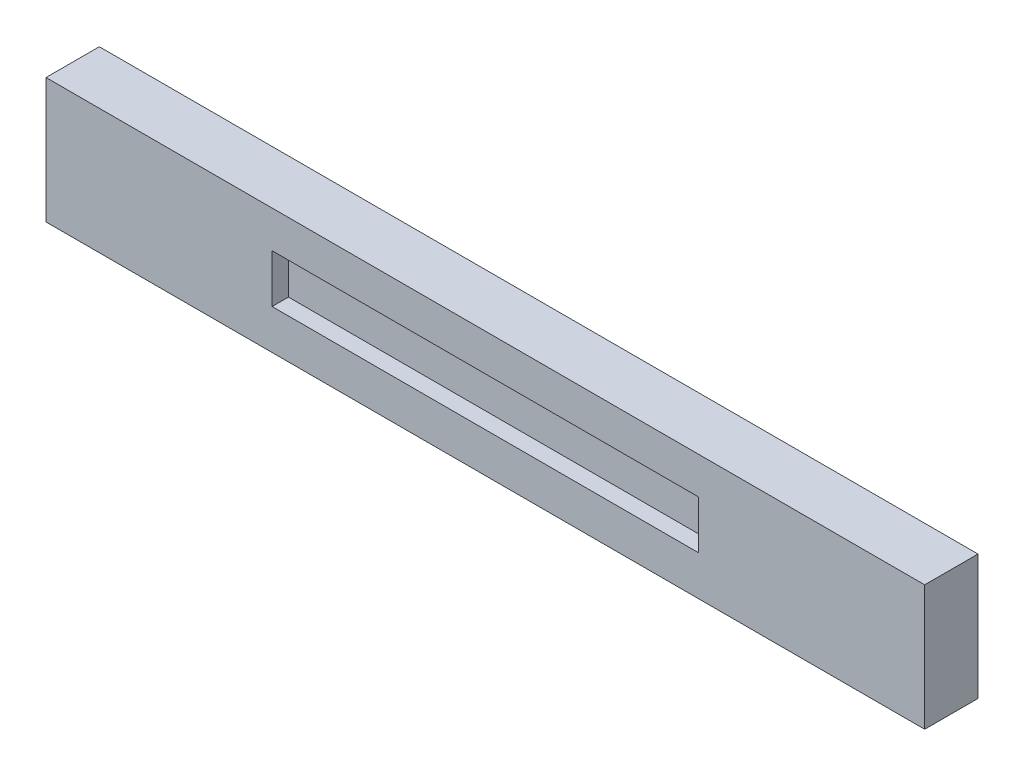
ISO-10303-21;
HEADER;
FILE_DESCRIPTION(('STEP AP214'),'2;1');
FILE_NAME('part.step','',(''),(''),'','','');
FILE_SCHEMA(('AUTOMOTIVE_DESIGN { 1 0 10303 214 1 1 1 1 }'));
ENDSEC;
DATA;
#1=APPLICATION_CONTEXT('core data for automotive mechanical design processes');
#2=APPLICATION_PROTOCOL_DEFINITION('international standard','automotive_design',2000,#1);
#3=PRODUCT_CONTEXT('',#1,'mechanical');
#4=PRODUCT('Part','Part','',(#3));
#5=PRODUCT_RELATED_PRODUCT_CATEGORY('part','',(#4));
#6=PRODUCT_DEFINITION_FORMATION('','',#4);
#7=PRODUCT_DEFINITION_CONTEXT('part definition',#1,'design');
#8=PRODUCT_DEFINITION('design','',#6,#7);
#9=PRODUCT_DEFINITION_SHAPE('','',#8);
#10=(LENGTH_UNIT() NAMED_UNIT(*) SI_UNIT(.MILLI.,.METRE.));
#11=(NAMED_UNIT(*) PLANE_ANGLE_UNIT() SI_UNIT($,.RADIAN.));
#12=(NAMED_UNIT(*) SI_UNIT($,.STERADIAN.) SOLID_ANGLE_UNIT());
#13=UNCERTAINTY_MEASURE_WITH_UNIT(LENGTH_MEASURE(1.E-05),#10,'distance_accuracy_value','');
#14=(GEOMETRIC_REPRESENTATION_CONTEXT(3) GLOBAL_UNCERTAINTY_ASSIGNED_CONTEXT((#13)) GLOBAL_UNIT_ASSIGNED_CONTEXT((#10,
#11,#12)) REPRESENTATION_CONTEXT('',''));
#15=CARTESIAN_POINT('',(0.,0.,0.));
#16=DIRECTION('',(0.,0.,1.));
#17=DIRECTION('',(1.,0.,0.));
#18=AXIS2_PLACEMENT_3D('',#15,#16,#17);
#19=CARTESIAN_POINT('',(0.,0.,38.5));
#20=DIRECTION('',(0.,0.,-1.));
#21=DIRECTION('',(-1.,0.,0.));
#22=AXIS2_PLACEMENT_3D('',#19,#20,#21);
#23=PLANE('',#22);
#24=DIRECTION('',(0.,-1.,0.));
#25=VECTOR('',#24,1.);
#26=CARTESIAN_POINT('',(0.,0.,38.5));
#27=LINE('',#26,#25);
#28=CARTESIAN_POINT('',(0.,88.,38.5));
#29=VERTEX_POINT('',#28);
#30=CARTESIAN_POINT('',(0.,0.,38.5));
#31=VERTEX_POINT('',#30);
#32=EDGE_CURVE('E145',#29,#31,#27,.T.);
#33=ORIENTED_EDGE('',*,*,#32,.T.);
#34=DIRECTION('',(1.,0.,0.));
#35=VECTOR('',#34,1.);
#36=CARTESIAN_POINT('',(0.,0.,38.5));
#37=LINE('',#36,#35);
#38=CARTESIAN_POINT('',(618.,0.,38.5));
#39=VERTEX_POINT('',#38);
#40=EDGE_CURVE('E92',#31,#39,#37,.T.);
#41=ORIENTED_EDGE('',*,*,#40,.T.);
#42=DIRECTION('',(0.,1.,0.));
#43=VECTOR('',#42,1.);
#44=CARTESIAN_POINT('',(618.,0.,38.5));
#45=LINE('',#44,#43);
#46=CARTESIAN_POINT('',(618.,88.,38.5));
#47=VERTEX_POINT('',#46);
#48=EDGE_CURVE('E148',#39,#47,#45,.T.);
#49=ORIENTED_EDGE('',*,*,#48,.T.);
#50=DIRECTION('',(-1.,0.,0.));
#51=VECTOR('',#50,1.);
#52=CARTESIAN_POINT('',(0.,88.,38.5));
#53=LINE('',#52,#51);
#54=EDGE_CURVE('E63',#47,#29,#53,.T.);
#55=ORIENTED_EDGE('',*,*,#54,.T.);
#56=EDGE_LOOP('',(#33,#41,#49,#55));
#57=FACE_BOUND('',#56,.T.);
#58=DIRECTION('',(0.,-1.,0.));
#59=VECTOR('',#58,1.);
#60=CARTESIAN_POINT('',(159.,0.,38.5));
#61=LINE('',#60,#59);
#62=CARTESIAN_POINT('',(159.,62.,38.5));
#63=VERTEX_POINT('',#62);
#64=CARTESIAN_POINT('',(159.,28.,38.5));
#65=VERTEX_POINT('',#64);
#66=EDGE_CURVE('E11',#63,#65,#61,.T.);
#67=ORIENTED_EDGE('',*,*,#66,.F.);
#68=DIRECTION('',(-1.,0.,0.));
#69=VECTOR('',#68,1.);
#70=CARTESIAN_POINT('',(0.,62.,38.5));
#71=LINE('',#70,#69);
#72=CARTESIAN_POINT('',(459.,62.,38.5));
#73=VERTEX_POINT('',#72);
#74=EDGE_CURVE('E167',#73,#63,#71,.T.);
#75=ORIENTED_EDGE('',*,*,#74,.F.);
#76=DIRECTION('',(0.,1.,0.));
#77=VECTOR('',#76,1.);
#78=CARTESIAN_POINT('',(459.,0.,38.5));
#79=LINE('',#78,#77);
#80=CARTESIAN_POINT('',(459.,28.,38.5));
#81=VERTEX_POINT('',#80);
#82=EDGE_CURVE('E169',#81,#73,#79,.T.);
#83=ORIENTED_EDGE('',*,*,#82,.F.);
#84=DIRECTION('',(1.,0.,0.));
#85=VECTOR('',#84,1.);
#86=CARTESIAN_POINT('',(0.,28.,38.5));
#87=LINE('',#86,#85);
#88=EDGE_CURVE('E47',#65,#81,#87,.T.);
#89=ORIENTED_EDGE('',*,*,#88,.F.);
#90=EDGE_LOOP('',(#67,#75,#83,#89));
#91=FACE_BOUND('',#90,.T.);
#92=ADVANCED_FACE('F39',(#57,#91),#23,.F.);
#93=CARTESIAN_POINT('',(0.,0.,38.5));
#94=DIRECTION('',(1.,0.,0.));
#95=DIRECTION('',(0.,0.,-1.));
#96=AXIS2_PLACEMENT_3D('',#93,#94,#95);
#97=PLANE('',#96);
#98=DIRECTION('',(0.,-1.,0.));
#99=VECTOR('',#98,1.);
#100=CARTESIAN_POINT('',(0.,0.,1.));
#101=LINE('',#100,#99);
#102=CARTESIAN_POINT('',(0.,88.,1.));
#103=VERTEX_POINT('',#102);
#104=CARTESIAN_POINT('',(0.,0.,1.));
#105=VERTEX_POINT('',#104);
#106=EDGE_CURVE('E122',#103,#105,#101,.T.);
#107=ORIENTED_EDGE('',*,*,#106,.T.);
#108=DIRECTION('',(0.,0.,-1.));
#109=VECTOR('',#108,1.);
#110=CARTESIAN_POINT('',(0.,0.,38.5));
#111=LINE('',#110,#109);
#112=EDGE_CURVE('E165',#31,#105,#111,.T.);
#113=ORIENTED_EDGE('',*,*,#112,.F.);
#114=ORIENTED_EDGE('',*,*,#32,.F.);
#115=DIRECTION('',(0.,0.,-1.));
#116=VECTOR('',#115,1.);
#117=CARTESIAN_POINT('',(0.,88.,38.5));
#118=LINE('',#117,#116);
#119=EDGE_CURVE('E151',#29,#103,#118,.T.);
#120=ORIENTED_EDGE('',*,*,#119,.T.);
#121=EDGE_LOOP('',(#107,#113,#114,#120));
#122=FACE_BOUND('',#121,.T.);
#123=ADVANCED_FACE('F41',(#122),#97,.F.);
#124=CARTESIAN_POINT('',(0.,0.,38.5));
#125=DIRECTION('',(0.,1.,0.));
#126=DIRECTION('',(0.,0.,1.));
#127=AXIS2_PLACEMENT_3D('',#124,#125,#126);
#128=PLANE('',#127);
#129=DIRECTION('',(1.,0.,0.));
#130=VECTOR('',#129,1.);
#131=CARTESIAN_POINT('',(0.,0.,1.));
#132=LINE('',#131,#130);
#133=CARTESIAN_POINT('',(618.,0.,1.));
#134=VERTEX_POINT('',#133);
#135=EDGE_CURVE('E154',#105,#134,#132,.T.);
#136=ORIENTED_EDGE('',*,*,#135,.T.);
#137=DIRECTION('',(0.,0.,-1.));
#138=VECTOR('',#137,1.);
#139=CARTESIAN_POINT('',(618.,0.,38.5));
#140=LINE('',#139,#138);
#141=EDGE_CURVE('E162',#39,#134,#140,.T.);
#142=ORIENTED_EDGE('',*,*,#141,.F.);
#143=ORIENTED_EDGE('',*,*,#40,.F.);
#144=ORIENTED_EDGE('',*,*,#112,.T.);
#145=EDGE_LOOP('',(#136,#142,#143,#144));
#146=FACE_BOUND('',#145,.T.);
#147=ADVANCED_FACE('F191',(#146),#128,.F.);
#148=CARTESIAN_POINT('',(618.,0.,38.5));
#149=DIRECTION('',(-1.,0.,0.));
#150=DIRECTION('',(0.,0.,1.));
#151=AXIS2_PLACEMENT_3D('',#148,#149,#150);
#152=PLANE('',#151);
#153=DIRECTION('',(0.,1.,0.));
#154=VECTOR('',#153,1.);
#155=CARTESIAN_POINT('',(618.,0.,1.));
#156=LINE('',#155,#154);
#157=CARTESIAN_POINT('',(618.,88.,1.));
#158=VERTEX_POINT('',#157);
#159=EDGE_CURVE('E156',#134,#158,#156,.T.);
#160=ORIENTED_EDGE('',*,*,#159,.T.);
#161=DIRECTION('',(0.,0.,-1.));
#162=VECTOR('',#161,1.);
#163=CARTESIAN_POINT('',(618.,88.,38.5));
#164=LINE('',#163,#162);
#165=EDGE_CURVE('E160',#47,#158,#164,.T.);
#166=ORIENTED_EDGE('',*,*,#165,.F.);
#167=ORIENTED_EDGE('',*,*,#48,.F.);
#168=ORIENTED_EDGE('',*,*,#141,.T.);
#169=EDGE_LOOP('',(#160,#166,#167,#168));
#170=FACE_BOUND('',#169,.T.);
#171=ADVANCED_FACE('F202',(#170),#152,.F.);
#172=CARTESIAN_POINT('',(0.,88.,38.5));
#173=DIRECTION('',(0.,-1.,0.));
#174=DIRECTION('',(0.,0.,-1.));
#175=AXIS2_PLACEMENT_3D('',#172,#173,#174);
#176=PLANE('',#175);
#177=DIRECTION('',(-1.,0.,0.));
#178=VECTOR('',#177,1.);
#179=CARTESIAN_POINT('',(0.,88.,1.));
#180=LINE('',#179,#178);
#181=EDGE_CURVE('E84',#158,#103,#180,.T.);
#182=ORIENTED_EDGE('',*,*,#181,.T.);
#183=ORIENTED_EDGE('',*,*,#119,.F.);
#184=ORIENTED_EDGE('',*,*,#54,.F.);
#185=ORIENTED_EDGE('',*,*,#165,.T.);
#186=EDGE_LOOP('',(#182,#183,#184,#185));
#187=FACE_BOUND('',#186,.T.);
#188=ADVANCED_FACE('F198',(#187),#176,.F.);
#189=CARTESIAN_POINT('',(0.,0.,1.));
#190=DIRECTION('',(0.,0.,-1.));
#191=DIRECTION('',(-1.,0.,0.));
#192=AXIS2_PLACEMENT_3D('',#189,#190,#191);
#193=PLANE('',#192);
#194=ORIENTED_EDGE('',*,*,#106,.F.);
#195=ORIENTED_EDGE('',*,*,#181,.F.);
#196=ORIENTED_EDGE('',*,*,#159,.F.);
#197=ORIENTED_EDGE('',*,*,#135,.F.);
#198=EDGE_LOOP('',(#194,#195,#196,#197));
#199=FACE_BOUND('',#198,.T.);
#200=ADVANCED_FACE('F196',(#199),#193,.T.);
#201=CARTESIAN_POINT('',(159.,28.,41.));
#202=DIRECTION('',(1.,0.,0.));
#203=DIRECTION('',(0.,0.,-1.));
#204=AXIS2_PLACEMENT_3D('',#201,#202,#203);
#205=PLANE('',#204);
#206=ORIENTED_EDGE('',*,*,#66,.T.);
#207=DIRECTION('',(0.,0.,-1.));
#208=VECTOR('',#207,1.);
#209=CARTESIAN_POINT('',(159.,28.,41.));
#210=LINE('',#209,#208);
#211=CARTESIAN_POINT('',(159.,28.,27.));
#212=VERTEX_POINT('',#211);
#213=EDGE_CURVE('E113',#65,#212,#210,.T.);
#214=ORIENTED_EDGE('',*,*,#213,.T.);
#215=DIRECTION('',(0.,-1.,0.));
#216=VECTOR('',#215,1.);
#217=CARTESIAN_POINT('',(159.,28.,27.));
#218=LINE('',#217,#216);
#219=CARTESIAN_POINT('',(159.,62.,27.));
#220=VERTEX_POINT('',#219);
#221=EDGE_CURVE('E118',#220,#212,#218,.T.);
#222=ORIENTED_EDGE('',*,*,#221,.F.);
#223=DIRECTION('',(0.,0.,-1.));
#224=VECTOR('',#223,1.);
#225=CARTESIAN_POINT('',(159.,62.,41.));
#226=LINE('',#225,#224);
#227=EDGE_CURVE('E141',#63,#220,#226,.T.);
#228=ORIENTED_EDGE('',*,*,#227,.F.);
#229=EDGE_LOOP('',(#206,#214,#222,#228));
#230=FACE_BOUND('',#229,.T.);
#231=ADVANCED_FACE('F115',(#230),#205,.T.);
#232=CARTESIAN_POINT('',(159.,28.,41.));
#233=DIRECTION('',(0.,1.,0.));
#234=DIRECTION('',(0.,0.,1.));
#235=AXIS2_PLACEMENT_3D('',#232,#233,#234);
#236=PLANE('',#235);
#237=ORIENTED_EDGE('',*,*,#88,.T.);
#238=DIRECTION('',(0.,0.,-1.));
#239=VECTOR('',#238,1.);
#240=CARTESIAN_POINT('',(459.,28.,41.));
#241=LINE('',#240,#239);
#242=CARTESIAN_POINT('',(459.,28.,27.));
#243=VERTEX_POINT('',#242);
#244=EDGE_CURVE('E123',#81,#243,#241,.T.);
#245=ORIENTED_EDGE('',*,*,#244,.T.);
#246=DIRECTION('',(1.,0.,0.));
#247=VECTOR('',#246,1.);
#248=CARTESIAN_POINT('',(159.,28.,27.));
#249=LINE('',#248,#247);
#250=EDGE_CURVE('E126',#212,#243,#249,.T.);
#251=ORIENTED_EDGE('',*,*,#250,.F.);
#252=ORIENTED_EDGE('',*,*,#213,.F.);
#253=EDGE_LOOP('',(#237,#245,#251,#252));
#254=FACE_BOUND('',#253,.T.);
#255=ADVANCED_FACE('F127',(#254),#236,.T.);
#256=CARTESIAN_POINT('',(459.,28.,41.));
#257=DIRECTION('',(-1.,0.,0.));
#258=DIRECTION('',(0.,0.,1.));
#259=AXIS2_PLACEMENT_3D('',#256,#257,#258);
#260=PLANE('',#259);
#261=ORIENTED_EDGE('',*,*,#82,.T.);
#262=DIRECTION('',(0.,0.,-1.));
#263=VECTOR('',#262,1.);
#264=CARTESIAN_POINT('',(459.,62.,41.));
#265=LINE('',#264,#263);
#266=CARTESIAN_POINT('',(459.,62.,27.));
#267=VERTEX_POINT('',#266);
#268=EDGE_CURVE('E54',#73,#267,#265,.T.);
#269=ORIENTED_EDGE('',*,*,#268,.T.);
#270=DIRECTION('',(0.,1.,0.));
#271=VECTOR('',#270,1.);
#272=CARTESIAN_POINT('',(459.,28.,27.));
#273=LINE('',#272,#271);
#274=EDGE_CURVE('E132',#243,#267,#273,.T.);
#275=ORIENTED_EDGE('',*,*,#274,.F.);
#276=ORIENTED_EDGE('',*,*,#244,.F.);
#277=EDGE_LOOP('',(#261,#269,#275,#276));
#278=FACE_BOUND('',#277,.T.);
#279=ADVANCED_FACE('F173',(#278),#260,.T.);
#280=CARTESIAN_POINT('',(159.,62.,41.));
#281=DIRECTION('',(0.,-1.,0.));
#282=DIRECTION('',(0.,0.,-1.));
#283=AXIS2_PLACEMENT_3D('',#280,#281,#282);
#284=PLANE('',#283);
#285=ORIENTED_EDGE('',*,*,#74,.T.);
#286=ORIENTED_EDGE('',*,*,#227,.T.);
#287=DIRECTION('',(-1.,0.,0.));
#288=VECTOR('',#287,1.);
#289=CARTESIAN_POINT('',(159.,62.,27.));
#290=LINE('',#289,#288);
#291=EDGE_CURVE('E136',#267,#220,#290,.T.);
#292=ORIENTED_EDGE('',*,*,#291,.F.);
#293=ORIENTED_EDGE('',*,*,#268,.F.);
#294=EDGE_LOOP('',(#285,#286,#292,#293));
#295=FACE_BOUND('',#294,.T.);
#296=ADVANCED_FACE('F175',(#295),#284,.T.);
#297=CARTESIAN_POINT('',(0.,0.,27.));
#298=DIRECTION('',(0.,0.,-1.));
#299=DIRECTION('',(-1.,0.,0.));
#300=AXIS2_PLACEMENT_3D('',#297,#298,#299);
#301=PLANE('',#300);
#302=ORIENTED_EDGE('',*,*,#221,.T.);
#303=ORIENTED_EDGE('',*,*,#250,.T.);
#304=ORIENTED_EDGE('',*,*,#274,.T.);
#305=ORIENTED_EDGE('',*,*,#291,.T.);
#306=EDGE_LOOP('',(#302,#303,#304,#305));
#307=FACE_BOUND('',#306,.T.);
#308=ADVANCED_FACE('F135',(#307),#301,.F.);
#309=CLOSED_SHELL('',(#92,#123,#147,#171,#188,#200,#231,#255,#279,#296,#308));
#310=MANIFOLD_SOLID_BREP('B2',#309);
#311=ADVANCED_BREP_SHAPE_REPRESENTATION('',(#18,#310),#14);
#312=SHAPE_DEFINITION_REPRESENTATION(#9,#311);
ENDSEC;
END-ISO-10303-21;
